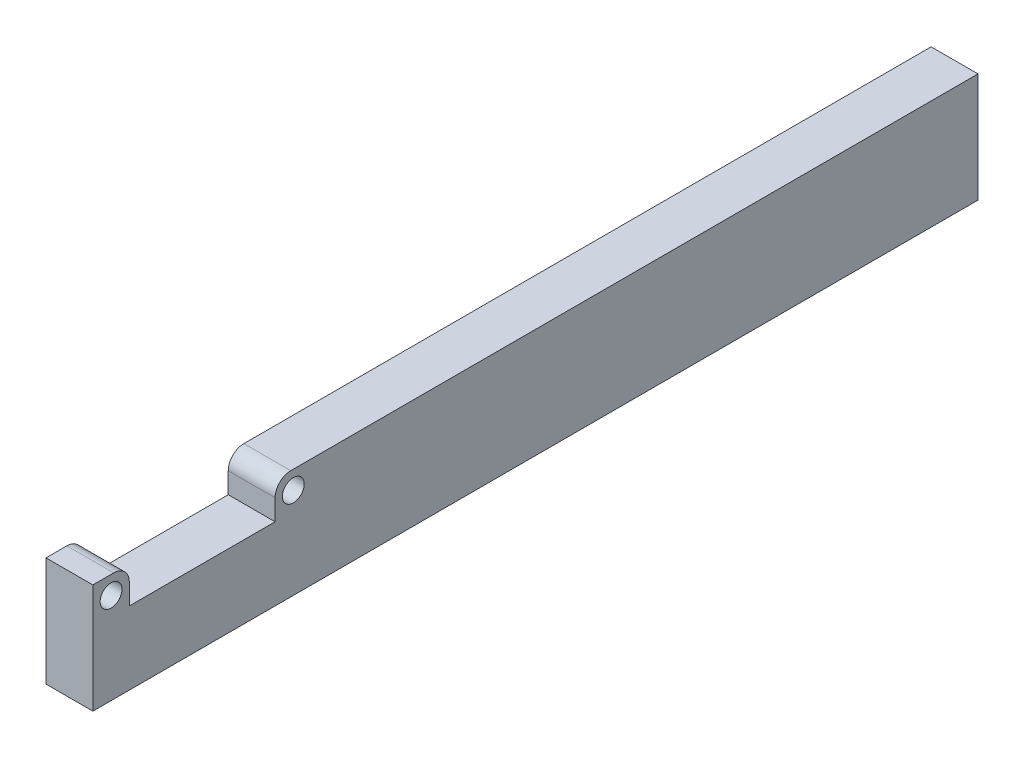
ISO-10303-21;
HEADER;
FILE_DESCRIPTION(('STEP AP214'),'2;1');
FILE_NAME('part.step','',(''),(''),'','','');
FILE_SCHEMA(('AUTOMOTIVE_DESIGN { 1 0 10303 214 1 1 1 1 }'));
ENDSEC;
DATA;
#1=APPLICATION_CONTEXT('core data for automotive mechanical design processes');
#2=APPLICATION_PROTOCOL_DEFINITION('international standard','automotive_design',2000,#1);
#3=PRODUCT_CONTEXT('',#1,'mechanical');
#4=PRODUCT('Part','Part','',(#3));
#5=PRODUCT_RELATED_PRODUCT_CATEGORY('part','',(#4));
#6=PRODUCT_DEFINITION_FORMATION('','',#4);
#7=PRODUCT_DEFINITION_CONTEXT('part definition',#1,'design');
#8=PRODUCT_DEFINITION('design','',#6,#7);
#9=PRODUCT_DEFINITION_SHAPE('','',#8);
#10=(LENGTH_UNIT() NAMED_UNIT(*) SI_UNIT(.MILLI.,.METRE.));
#11=(NAMED_UNIT(*) PLANE_ANGLE_UNIT() SI_UNIT($,.RADIAN.));
#12=(NAMED_UNIT(*) SI_UNIT($,.STERADIAN.) SOLID_ANGLE_UNIT());
#13=UNCERTAINTY_MEASURE_WITH_UNIT(LENGTH_MEASURE(1.E-05),#10,'distance_accuracy_value','');
#14=(GEOMETRIC_REPRESENTATION_CONTEXT(3) GLOBAL_UNCERTAINTY_ASSIGNED_CONTEXT((#13)) GLOBAL_UNIT_ASSIGNED_CONTEXT((#10,
#11,#12)) REPRESENTATION_CONTEXT('',''));
#15=CARTESIAN_POINT('',(0.,0.,0.));
#16=DIRECTION('',(0.,0.,1.));
#17=DIRECTION('',(1.,0.,0.));
#18=AXIS2_PLACEMENT_3D('',#15,#16,#17);
#19=CARTESIAN_POINT('',(4.5,21.,0.));
#20=DIRECTION('',(0.,1.,0.));
#21=DIRECTION('',(0.,0.,1.));
#22=AXIS2_PLACEMENT_3D('',#19,#20,#21);
#23=PLANE('',#22);
#24=DIRECTION('',(0.,0.,-1.));
#25=VECTOR('',#24,1.);
#26=CARTESIAN_POINT('',(-4.5,21.,0.));
#27=LINE('',#26,#25);
#28=CARTESIAN_POINT('',(-4.5,21.,-38.));
#29=VERTEX_POINT('',#28);
#30=CARTESIAN_POINT('',(-4.5,21.,-170.));
#31=VERTEX_POINT('',#30);
#32=EDGE_CURVE('E160',#29,#31,#27,.T.);
#33=ORIENTED_EDGE('',*,*,#32,.F.);
#34=DIRECTION('',(1.,0.,0.));
#35=VECTOR('',#34,1.);
#36=CARTESIAN_POINT('',(4.5,21.,-38.));
#37=LINE('',#36,#35);
#38=CARTESIAN_POINT('',(4.5,21.,-38.));
#39=VERTEX_POINT('',#38);
#40=EDGE_CURVE('E169',#29,#39,#37,.T.);
#41=ORIENTED_EDGE('',*,*,#40,.T.);
#42=DIRECTION('',(0.,0.,-1.));
#43=VECTOR('',#42,1.);
#44=CARTESIAN_POINT('',(4.5,21.,0.));
#45=LINE('',#44,#43);
#46=CARTESIAN_POINT('',(4.5,21.,-170.));
#47=VERTEX_POINT('',#46);
#48=EDGE_CURVE('E148',#39,#47,#45,.T.);
#49=ORIENTED_EDGE('',*,*,#48,.T.);
#50=DIRECTION('',(-1.,0.,0.));
#51=VECTOR('',#50,1.);
#52=CARTESIAN_POINT('',(4.5,21.,-170.));
#53=LINE('',#52,#51);
#54=EDGE_CURVE('E173',#47,#31,#53,.T.);
#55=ORIENTED_EDGE('',*,*,#54,.T.);
#56=EDGE_LOOP('',(#33,#41,#49,#55));
#57=FACE_BOUND('',#56,.T.);
#58=ADVANCED_FACE('F32',(#57),#23,.T.);
#59=CARTESIAN_POINT('',(4.5,0.,0.));
#60=DIRECTION('',(0.,0.,1.));
#61=DIRECTION('',(1.,0.,0.));
#62=AXIS2_PLACEMENT_3D('',#59,#60,#61);
#63=PLANE('',#62);
#64=DIRECTION('',(0.,1.,0.));
#65=VECTOR('',#64,1.);
#66=CARTESIAN_POINT('',(-4.5,0.,0.));
#67=LINE('',#66,#65);
#68=CARTESIAN_POINT('',(-4.5,0.,0.));
#69=VERTEX_POINT('',#68);
#70=CARTESIAN_POINT('',(-4.5,21.,0.));
#71=VERTEX_POINT('',#70);
#72=EDGE_CURVE('E143',#69,#71,#67,.T.);
#73=ORIENTED_EDGE('',*,*,#72,.F.);
#74=DIRECTION('',(-1.,0.,0.));
#75=VECTOR('',#74,1.);
#76=CARTESIAN_POINT('',(4.5,0.,0.));
#77=LINE('',#76,#75);
#78=CARTESIAN_POINT('',(4.5,0.,0.));
#79=VERTEX_POINT('',#78);
#80=EDGE_CURVE('E167',#79,#69,#77,.T.);
#81=ORIENTED_EDGE('',*,*,#80,.F.);
#82=DIRECTION('',(0.,1.,0.));
#83=VECTOR('',#82,1.);
#84=CARTESIAN_POINT('',(4.5,0.,0.));
#85=LINE('',#84,#83);
#86=CARTESIAN_POINT('',(4.5,21.,0.));
#87=VERTEX_POINT('',#86);
#88=EDGE_CURVE('E145',#79,#87,#85,.T.);
#89=ORIENTED_EDGE('',*,*,#88,.T.);
#90=DIRECTION('',(-1.,0.,0.));
#91=VECTOR('',#90,1.);
#92=CARTESIAN_POINT('',(4.5,21.,0.));
#93=LINE('',#92,#91);
#94=EDGE_CURVE('E157',#87,#71,#93,.T.);
#95=ORIENTED_EDGE('',*,*,#94,.T.);
#96=EDGE_LOOP('',(#73,#81,#89,#95));
#97=FACE_BOUND('',#96,.T.);
#98=ADVANCED_FACE('F206',(#97),#63,.T.);
#99=CARTESIAN_POINT('',(4.5,0.,0.));
#100=DIRECTION('',(0.,1.,0.));
#101=DIRECTION('',(0.,0.,1.));
#102=AXIS2_PLACEMENT_3D('',#99,#100,#101);
#103=PLANE('',#102);
#104=DIRECTION('',(0.,0.,-1.));
#105=VECTOR('',#104,1.);
#106=CARTESIAN_POINT('',(-4.5,0.,0.));
#107=LINE('',#106,#105);
#108=CARTESIAN_POINT('',(-4.5,0.,-170.));
#109=VERTEX_POINT('',#108);
#110=EDGE_CURVE('E149',#69,#109,#107,.T.);
#111=ORIENTED_EDGE('',*,*,#110,.T.);
#112=DIRECTION('',(-1.,0.,0.));
#113=VECTOR('',#112,1.);
#114=CARTESIAN_POINT('',(4.5,0.,-170.));
#115=LINE('',#114,#113);
#116=CARTESIAN_POINT('',(4.5,0.,-170.));
#117=VERTEX_POINT('',#116);
#118=EDGE_CURVE('E170',#117,#109,#115,.T.);
#119=ORIENTED_EDGE('',*,*,#118,.F.);
#120=DIRECTION('',(0.,0.,-1.));
#121=VECTOR('',#120,1.);
#122=CARTESIAN_POINT('',(4.5,0.,0.));
#123=LINE('',#122,#121);
#124=EDGE_CURVE('E155',#79,#117,#123,.T.);
#125=ORIENTED_EDGE('',*,*,#124,.F.);
#126=ORIENTED_EDGE('',*,*,#80,.T.);
#127=EDGE_LOOP('',(#111,#119,#125,#126));
#128=FACE_BOUND('',#127,.T.);
#129=ADVANCED_FACE('F211',(#128),#103,.F.);
#130=CARTESIAN_POINT('',(4.5,0.,-170.));
#131=DIRECTION('',(0.,0.,1.));
#132=DIRECTION('',(1.,0.,0.));
#133=AXIS2_PLACEMENT_3D('',#130,#131,#132);
#134=PLANE('',#133);
#135=DIRECTION('',(0.,1.,0.));
#136=VECTOR('',#135,1.);
#137=CARTESIAN_POINT('',(-4.5,0.,-170.));
#138=LINE('',#137,#136);
#139=EDGE_CURVE('E163',#109,#31,#138,.T.);
#140=ORIENTED_EDGE('',*,*,#139,.T.);
#141=ORIENTED_EDGE('',*,*,#54,.F.);
#142=DIRECTION('',(0.,1.,0.));
#143=VECTOR('',#142,1.);
#144=CARTESIAN_POINT('',(4.5,0.,-170.));
#145=LINE('',#144,#143);
#146=EDGE_CURVE('E152',#117,#47,#145,.T.);
#147=ORIENTED_EDGE('',*,*,#146,.F.);
#148=ORIENTED_EDGE('',*,*,#118,.T.);
#149=EDGE_LOOP('',(#140,#141,#147,#148));
#150=FACE_BOUND('',#149,.T.);
#151=ADVANCED_FACE('F214',(#150),#134,.F.);
#152=CARTESIAN_POINT('',(4.5,21.,-4.));
#153=VERTEX_POINT('',#152);
#154=EDGE_CURVE('E150',#87,#153,#45,.T.);
#155=ORIENTED_EDGE('',*,*,#154,.T.);
#156=DIRECTION('',(1.,0.,0.));
#157=VECTOR('',#156,1.);
#158=CARTESIAN_POINT('',(-4.5,21.,-4.));
#159=LINE('',#158,#157);
#160=CARTESIAN_POINT('',(-4.5,21.,-4.));
#161=VERTEX_POINT('',#160);
#162=EDGE_CURVE('E11',#153,#161,#159,.F.);
#163=ORIENTED_EDGE('',*,*,#162,.T.);
#164=EDGE_CURVE('E161',#71,#161,#27,.T.);
#165=ORIENTED_EDGE('',*,*,#164,.F.);
#166=ORIENTED_EDGE('',*,*,#94,.F.);
#167=EDGE_LOOP('',(#155,#163,#165,#166));
#168=FACE_BOUND('',#167,.T.);
#169=ADVANCED_FACE('F203',(#168),#23,.T.);
#170=CARTESIAN_POINT('',(4.5,0.,0.));
#171=DIRECTION('',(-1.,0.,0.));
#172=DIRECTION('',(0.,0.,1.));
#173=AXIS2_PLACEMENT_3D('',#170,#171,#172);
#174=PLANE('',#173);
#175=CARTESIAN_POINT('',(4.5,17.5,-3.49999999999999));
#176=DIRECTION('',(1.,0.,0.));
#177=DIRECTION('',(0.,0.,-1.));
#178=AXIS2_PLACEMENT_3D('',#175,#176,#177);
#179=CIRCLE('',#178,2.1);
#180=CARTESIAN_POINT('',(4.5,17.5,-5.59999999999999));
#181=VERTEX_POINT('',#180);
#182=EDGE_CURVE('E268',#181,#181,#179,.T.);
#183=ORIENTED_EDGE('',*,*,#182,.F.);
#184=EDGE_LOOP('',(#183));
#185=FACE_BOUND('',#184,.T.);
#186=CARTESIAN_POINT('',(4.5,17.5,-38.5));
#187=DIRECTION('',(1.,0.,0.));
#188=DIRECTION('',(0.,0.,-1.));
#189=AXIS2_PLACEMENT_3D('',#186,#187,#188);
#190=CIRCLE('',#189,2.1);
#191=CARTESIAN_POINT('',(4.5,17.5,-40.6));
#192=VERTEX_POINT('',#191);
#193=EDGE_CURVE('E263',#192,#192,#190,.T.);
#194=ORIENTED_EDGE('',*,*,#193,.F.);
#195=EDGE_LOOP('',(#194));
#196=FACE_BOUND('',#195,.T.);
#197=ORIENTED_EDGE('',*,*,#48,.F.);
#198=CARTESIAN_POINT('',(4.5,18.,-38.));
#199=DIRECTION('',(-1.,0.,0.));
#200=DIRECTION('',(0.,0.,1.));
#201=AXIS2_PLACEMENT_3D('',#198,#199,#200);
#202=CIRCLE('',#201,3.);
#203=CARTESIAN_POINT('',(4.5,18.,-35.));
#204=VERTEX_POINT('',#203);
#205=EDGE_CURVE('E181',#39,#204,#202,.F.);
#206=ORIENTED_EDGE('',*,*,#205,.T.);
#207=DIRECTION('',(0.,1.,0.));
#208=VECTOR('',#207,1.);
#209=CARTESIAN_POINT('',(4.5,14.,-35.));
#210=LINE('',#209,#208);
#211=CARTESIAN_POINT('',(4.5,14.,-35.));
#212=VERTEX_POINT('',#211);
#213=EDGE_CURVE('E133',#212,#204,#210,.T.);
#214=ORIENTED_EDGE('',*,*,#213,.F.);
#215=DIRECTION('',(0.,0.,-1.));
#216=VECTOR('',#215,1.);
#217=CARTESIAN_POINT('',(4.5,14.,-7.));
#218=LINE('',#217,#216);
#219=CARTESIAN_POINT('',(4.5,14.,-7.));
#220=VERTEX_POINT('',#219);
#221=EDGE_CURVE('E117',#220,#212,#218,.T.);
#222=ORIENTED_EDGE('',*,*,#221,.F.);
#223=DIRECTION('',(0.,-1.,0.));
#224=VECTOR('',#223,1.);
#225=CARTESIAN_POINT('',(4.5,21.,-7.));
#226=LINE('',#225,#224);
#227=CARTESIAN_POINT('',(4.5,18.,-7.));
#228=VERTEX_POINT('',#227);
#229=EDGE_CURVE('E110',#228,#220,#226,.T.);
#230=ORIENTED_EDGE('',*,*,#229,.F.);
#231=CARTESIAN_POINT('',(4.5,18.,-4.));
#232=DIRECTION('',(-1.,0.,0.));
#233=DIRECTION('',(0.,0.,1.));
#234=AXIS2_PLACEMENT_3D('',#231,#232,#233);
#235=CIRCLE('',#234,3.);
#236=EDGE_CURVE('E179',#228,#153,#235,.F.);
#237=ORIENTED_EDGE('',*,*,#236,.T.);
#238=ORIENTED_EDGE('',*,*,#154,.F.);
#239=ORIENTED_EDGE('',*,*,#88,.F.);
#240=ORIENTED_EDGE('',*,*,#124,.T.);
#241=ORIENTED_EDGE('',*,*,#146,.T.);
#242=EDGE_LOOP('',(#197,#206,#214,#222,#230,#237,#238,#239,#240,#241));
#243=FACE_BOUND('',#242,.T.);
#244=ADVANCED_FACE('F131',(#185,#196,#243),#174,.F.);
#245=CARTESIAN_POINT('',(-4.5,0.,0.));
#246=DIRECTION('',(-1.,0.,0.));
#247=DIRECTION('',(0.,0.,1.));
#248=AXIS2_PLACEMENT_3D('',#245,#246,#247);
#249=PLANE('',#248);
#250=CARTESIAN_POINT('',(-4.5,17.5,-3.49999999999999));
#251=DIRECTION('',(1.,0.,0.));
#252=DIRECTION('',(0.,0.,-1.));
#253=AXIS2_PLACEMENT_3D('',#250,#251,#252);
#254=CIRCLE('',#253,2.1);
#255=CARTESIAN_POINT('',(-4.5,17.5,-5.59999999999999));
#256=VERTEX_POINT('',#255);
#257=EDGE_CURVE('E260',#256,#256,#254,.T.);
#258=ORIENTED_EDGE('',*,*,#257,.T.);
#259=EDGE_LOOP('',(#258));
#260=FACE_BOUND('',#259,.T.);
#261=CARTESIAN_POINT('',(-4.5,17.5,-38.5));
#262=DIRECTION('',(1.,0.,0.));
#263=DIRECTION('',(0.,0.,-1.));
#264=AXIS2_PLACEMENT_3D('',#261,#262,#263);
#265=CIRCLE('',#264,2.1);
#266=CARTESIAN_POINT('',(-4.5,17.5,-40.6));
#267=VERTEX_POINT('',#266);
#268=EDGE_CURVE('E118',#267,#267,#265,.T.);
#269=ORIENTED_EDGE('',*,*,#268,.T.);
#270=EDGE_LOOP('',(#269));
#271=FACE_BOUND('',#270,.T.);
#272=DIRECTION('',(0.,1.,0.));
#273=VECTOR('',#272,1.);
#274=CARTESIAN_POINT('',(-4.5,14.,-35.));
#275=LINE('',#274,#273);
#276=CARTESIAN_POINT('',(-4.5,14.,-35.));
#277=VERTEX_POINT('',#276);
#278=CARTESIAN_POINT('',(-4.5,18.,-35.));
#279=VERTEX_POINT('',#278);
#280=EDGE_CURVE('E128',#277,#279,#275,.T.);
#281=ORIENTED_EDGE('',*,*,#280,.T.);
#282=CARTESIAN_POINT('',(-4.5,18.,-38.));
#283=DIRECTION('',(-1.,0.,0.));
#284=DIRECTION('',(0.,0.,1.));
#285=AXIS2_PLACEMENT_3D('',#282,#283,#284);
#286=CIRCLE('',#285,3.);
#287=EDGE_CURVE('E186',#279,#29,#286,.T.);
#288=ORIENTED_EDGE('',*,*,#287,.T.);
#289=ORIENTED_EDGE('',*,*,#32,.T.);
#290=ORIENTED_EDGE('',*,*,#139,.F.);
#291=ORIENTED_EDGE('',*,*,#110,.F.);
#292=ORIENTED_EDGE('',*,*,#72,.T.);
#293=ORIENTED_EDGE('',*,*,#164,.T.);
#294=CARTESIAN_POINT('',(-4.5,18.,-4.));
#295=DIRECTION('',(-1.,0.,0.));
#296=DIRECTION('',(0.,0.,1.));
#297=AXIS2_PLACEMENT_3D('',#294,#295,#296);
#298=CIRCLE('',#297,3.);
#299=CARTESIAN_POINT('',(-4.5,18.,-7.));
#300=VERTEX_POINT('',#299);
#301=EDGE_CURVE('E47',#161,#300,#298,.T.);
#302=ORIENTED_EDGE('',*,*,#301,.T.);
#303=DIRECTION('',(0.,-1.,0.));
#304=VECTOR('',#303,1.);
#305=CARTESIAN_POINT('',(-4.5,21.,-7.));
#306=LINE('',#305,#304);
#307=CARTESIAN_POINT('',(-4.5,14.,-7.));
#308=VERTEX_POINT('',#307);
#309=EDGE_CURVE('E135',#300,#308,#306,.T.);
#310=ORIENTED_EDGE('',*,*,#309,.T.);
#311=DIRECTION('',(0.,0.,-1.));
#312=VECTOR('',#311,1.);
#313=CARTESIAN_POINT('',(-4.5,14.,-7.));
#314=LINE('',#313,#312);
#315=EDGE_CURVE('E126',#308,#277,#314,.T.);
#316=ORIENTED_EDGE('',*,*,#315,.T.);
#317=EDGE_LOOP('',(#281,#288,#289,#290,#291,#292,#293,#302,#310,#316));
#318=FACE_BOUND('',#317,.T.);
#319=ADVANCED_FACE('F189',(#260,#271,#318),#249,.T.);
#320=CARTESIAN_POINT('',(-4.5,14.,-35.));
#321=DIRECTION('',(0.,0.,-1.));
#322=DIRECTION('',(-1.,0.,0.));
#323=AXIS2_PLACEMENT_3D('',#320,#321,#322);
#324=PLANE('',#323);
#325=ORIENTED_EDGE('',*,*,#213,.T.);
#326=DIRECTION('',(1.,0.,0.));
#327=VECTOR('',#326,1.);
#328=CARTESIAN_POINT('',(-4.5,18.,-35.));
#329=LINE('',#328,#327);
#330=EDGE_CURVE('E183',#204,#279,#329,.F.);
#331=ORIENTED_EDGE('',*,*,#330,.T.);
#332=ORIENTED_EDGE('',*,*,#280,.F.);
#333=DIRECTION('',(1.,0.,0.));
#334=VECTOR('',#333,1.);
#335=CARTESIAN_POINT('',(-4.5,14.,-35.));
#336=LINE('',#335,#334);
#337=EDGE_CURVE('E127',#277,#212,#336,.T.);
#338=ORIENTED_EDGE('',*,*,#337,.T.);
#339=EDGE_LOOP('',(#325,#331,#332,#338));
#340=FACE_BOUND('',#339,.T.);
#341=ADVANCED_FACE('F199',(#340),#324,.F.);
#342=CARTESIAN_POINT('',(-4.5,14.,-7.));
#343=DIRECTION('',(0.,-1.,0.));
#344=DIRECTION('',(0.,0.,-1.));
#345=AXIS2_PLACEMENT_3D('',#342,#343,#344);
#346=PLANE('',#345);
#347=ORIENTED_EDGE('',*,*,#337,.F.);
#348=ORIENTED_EDGE('',*,*,#315,.F.);
#349=DIRECTION('',(1.,0.,0.));
#350=VECTOR('',#349,1.);
#351=CARTESIAN_POINT('',(-4.5,14.,-7.));
#352=LINE('',#351,#350);
#353=EDGE_CURVE('E113',#308,#220,#352,.T.);
#354=ORIENTED_EDGE('',*,*,#353,.T.);
#355=ORIENTED_EDGE('',*,*,#221,.T.);
#356=EDGE_LOOP('',(#347,#348,#354,#355));
#357=FACE_BOUND('',#356,.T.);
#358=ADVANCED_FACE('F123',(#357),#346,.F.);
#359=CARTESIAN_POINT('',(-4.5,21.,-7.));
#360=DIRECTION('',(0.,0.,1.));
#361=DIRECTION('',(1.,0.,0.));
#362=AXIS2_PLACEMENT_3D('',#359,#360,#361);
#363=PLANE('',#362);
#364=ORIENTED_EDGE('',*,*,#309,.F.);
#365=DIRECTION('',(1.,0.,0.));
#366=VECTOR('',#365,1.);
#367=CARTESIAN_POINT('',(4.5,18.,-7.));
#368=LINE('',#367,#366);
#369=EDGE_CURVE('E40',#300,#228,#368,.T.);
#370=ORIENTED_EDGE('',*,*,#369,.T.);
#371=ORIENTED_EDGE('',*,*,#229,.T.);
#372=ORIENTED_EDGE('',*,*,#353,.F.);
#373=EDGE_LOOP('',(#364,#370,#371,#372));
#374=FACE_BOUND('',#373,.T.);
#375=ADVANCED_FACE('F112',(#374),#363,.F.);
#376=CARTESIAN_POINT('',(4.5,17.5,-38.5));
#377=DIRECTION('',(1.,0.,0.));
#378=DIRECTION('',(0.,0.,-1.));
#379=AXIS2_PLACEMENT_3D('',#376,#377,#378);
#380=CYLINDRICAL_SURFACE('',#379,2.1);
#381=ORIENTED_EDGE('',*,*,#268,.F.);
#382=EDGE_LOOP('',(#381));
#383=FACE_BOUND('',#382,.T.);
#384=ORIENTED_EDGE('',*,*,#193,.T.);
#385=EDGE_LOOP('',(#384));
#386=FACE_BOUND('',#385,.T.);
#387=ADVANCED_FACE('F234',(#383,#386),#380,.F.);
#388=CARTESIAN_POINT('',(4.5,17.5,-3.49999999999999));
#389=DIRECTION('',(1.,0.,0.));
#390=DIRECTION('',(0.,0.,-1.));
#391=AXIS2_PLACEMENT_3D('',#388,#389,#390);
#392=CYLINDRICAL_SURFACE('',#391,2.1);
#393=ORIENTED_EDGE('',*,*,#257,.F.);
#394=EDGE_LOOP('',(#393));
#395=FACE_BOUND('',#394,.T.);
#396=ORIENTED_EDGE('',*,*,#182,.T.);
#397=EDGE_LOOP('',(#396));
#398=FACE_BOUND('',#397,.T.);
#399=ADVANCED_FACE('F229',(#395,#398),#392,.F.);
#400=CARTESIAN_POINT('',(4.5,18.,-38.));
#401=DIRECTION('',(-1.,0.,0.));
#402=DIRECTION('',(0.,0.,1.));
#403=AXIS2_PLACEMENT_3D('',#400,#401,#402);
#404=CYLINDRICAL_SURFACE('',#403,3.);
#405=ORIENTED_EDGE('',*,*,#287,.F.);
#406=ORIENTED_EDGE('',*,*,#330,.F.);
#407=ORIENTED_EDGE('',*,*,#205,.F.);
#408=ORIENTED_EDGE('',*,*,#40,.F.);
#409=EDGE_LOOP('',(#405,#406,#407,#408));
#410=FACE_BOUND('',#409,.T.);
#411=ADVANCED_FACE('F197',(#410),#404,.T.);
#412=CARTESIAN_POINT('',(-4.5,18.,-4.));
#413=DIRECTION('',(-1.,0.,0.));
#414=DIRECTION('',(0.,0.,1.));
#415=AXIS2_PLACEMENT_3D('',#412,#413,#414);
#416=CYLINDRICAL_SURFACE('',#415,3.);
#417=ORIENTED_EDGE('',*,*,#301,.F.);
#418=ORIENTED_EDGE('',*,*,#162,.F.);
#419=ORIENTED_EDGE('',*,*,#236,.F.);
#420=ORIENTED_EDGE('',*,*,#369,.F.);
#421=EDGE_LOOP('',(#417,#418,#419,#420));
#422=FACE_BOUND('',#421,.T.);
#423=ADVANCED_FACE('F34',(#422),#416,.T.);
#424=CLOSED_SHELL('',(#58,#98,#129,#151,#169,#244,#319,#341,#358,#375,#387,#399,#411,#423));
#425=MANIFOLD_SOLID_BREP('B2',#424);
#426=ADVANCED_BREP_SHAPE_REPRESENTATION('',(#18,#425),#14);
#427=SHAPE_DEFINITION_REPRESENTATION(#9,#426);
ENDSEC;
END-ISO-10303-21;
